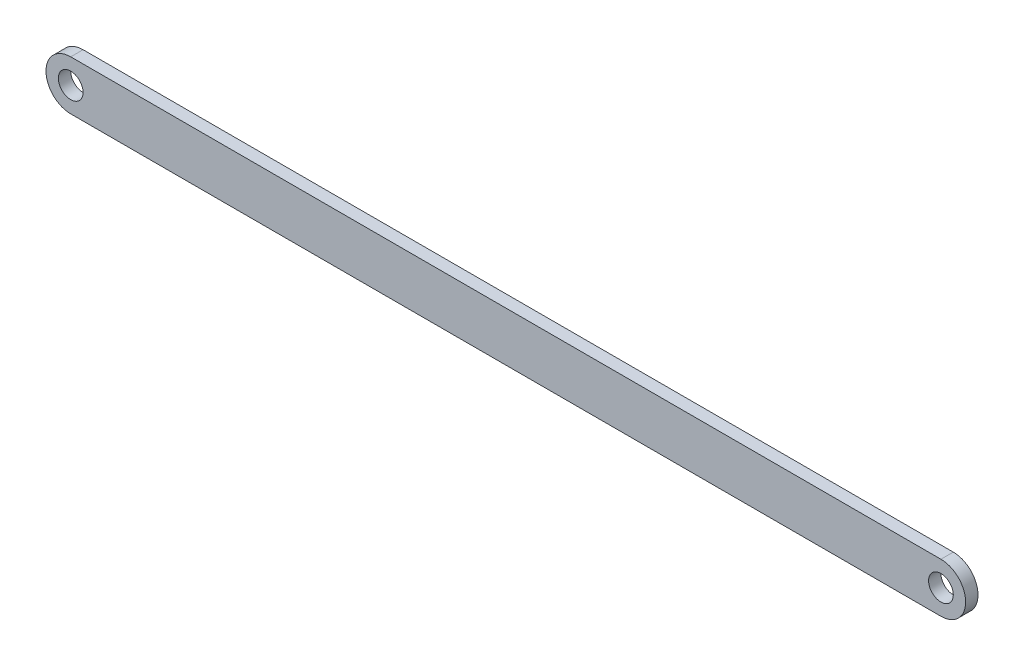
ISO-10303-21;
HEADER;
FILE_DESCRIPTION(('STEP AP214'),'2;1');
FILE_NAME('part.step','',(''),(''),'','','');
FILE_SCHEMA(('AUTOMOTIVE_DESIGN { 1 0 10303 214 1 1 1 1 }'));
ENDSEC;
DATA;
#1=APPLICATION_CONTEXT('core data for automotive mechanical design processes');
#2=APPLICATION_PROTOCOL_DEFINITION('international standard','automotive_design',2000,#1);
#3=PRODUCT_CONTEXT('',#1,'mechanical');
#4=PRODUCT('Part','Part','',(#3));
#5=PRODUCT_RELATED_PRODUCT_CATEGORY('part','',(#4));
#6=PRODUCT_DEFINITION_FORMATION('','',#4);
#7=PRODUCT_DEFINITION_CONTEXT('part definition',#1,'design');
#8=PRODUCT_DEFINITION('design','',#6,#7);
#9=PRODUCT_DEFINITION_SHAPE('','',#8);
#10=(LENGTH_UNIT() NAMED_UNIT(*) SI_UNIT(.MILLI.,.METRE.));
#11=(NAMED_UNIT(*) PLANE_ANGLE_UNIT() SI_UNIT($,.RADIAN.));
#12=(NAMED_UNIT(*) SI_UNIT($,.STERADIAN.) SOLID_ANGLE_UNIT());
#13=UNCERTAINTY_MEASURE_WITH_UNIT(LENGTH_MEASURE(1.E-05),#10,'distance_accuracy_value','');
#14=(GEOMETRIC_REPRESENTATION_CONTEXT(3) GLOBAL_UNCERTAINTY_ASSIGNED_CONTEXT((#13)) GLOBAL_UNIT_ASSIGNED_CONTEXT((#10,
#11,#12)) REPRESENTATION_CONTEXT('',''));
#15=CARTESIAN_POINT('',(0.,0.,0.));
#16=DIRECTION('',(0.,0.,1.));
#17=DIRECTION('',(1.,0.,0.));
#18=AXIS2_PLACEMENT_3D('',#15,#16,#17);
#19=CARTESIAN_POINT('',(35.21,0.,1.));
#20=DIRECTION('',(0.,0.,-1.));
#21=DIRECTION('',(-1.,0.,0.));
#22=AXIS2_PLACEMENT_3D('',#19,#20,#21);
#23=PLANE('',#22);
#24=CARTESIAN_POINT('',(35.21,0.,1.));
#25=DIRECTION('',(0.,0.,1.));
#26=DIRECTION('',(-1.,0.,0.));
#27=AXIS2_PLACEMENT_3D('',#24,#25,#26);
#28=CIRCLE('',#27,2.);
#29=CARTESIAN_POINT('',(35.21,-2.,1.));
#30=VERTEX_POINT('',#29);
#31=CARTESIAN_POINT('',(35.21,2.,1.));
#32=VERTEX_POINT('',#31);
#33=EDGE_CURVE('E96',#30,#32,#28,.T.);
#34=ORIENTED_EDGE('',*,*,#33,.T.);
#35=DIRECTION('',(-1.,0.,0.));
#36=VECTOR('',#35,1.);
#37=CARTESIAN_POINT('',(-35.21,2.,1.));
#38=LINE('',#37,#36);
#39=CARTESIAN_POINT('',(-35.21,2.,1.));
#40=VERTEX_POINT('',#39);
#41=EDGE_CURVE('E91',#32,#40,#38,.T.);
#42=ORIENTED_EDGE('',*,*,#41,.T.);
#43=CARTESIAN_POINT('',(-35.21,0.,1.));
#44=DIRECTION('',(0.,0.,1.));
#45=DIRECTION('',(1.,0.,0.));
#46=AXIS2_PLACEMENT_3D('',#43,#44,#45);
#47=CIRCLE('',#46,2.);
#48=CARTESIAN_POINT('',(-35.21,-2.,1.));
#49=VERTEX_POINT('',#48);
#50=EDGE_CURVE('E94',#40,#49,#47,.T.);
#51=ORIENTED_EDGE('',*,*,#50,.T.);
#52=DIRECTION('',(1.,0.,0.));
#53=VECTOR('',#52,1.);
#54=CARTESIAN_POINT('',(-35.21,-2.,1.));
#55=LINE('',#54,#53);
#56=EDGE_CURVE('E61',#49,#30,#55,.T.);
#57=ORIENTED_EDGE('',*,*,#56,.T.);
#58=EDGE_LOOP('',(#34,#42,#51,#57));
#59=FACE_BOUND('',#58,.T.);
#60=CARTESIAN_POINT('',(-35.21,0.,1.));
#61=DIRECTION('',(0.,0.,1.));
#62=DIRECTION('',(1.,0.,0.));
#63=AXIS2_PLACEMENT_3D('',#60,#61,#62);
#64=CIRCLE('',#63,0.999999999999998);
#65=CARTESIAN_POINT('',(-34.21,0.,1.));
#66=VERTEX_POINT('',#65);
#67=EDGE_CURVE('E116',#66,#66,#64,.T.);
#68=ORIENTED_EDGE('',*,*,#67,.F.);
#69=EDGE_LOOP('',(#68));
#70=FACE_BOUND('',#69,.T.);
#71=CARTESIAN_POINT('',(35.21,0.,1.));
#72=DIRECTION('',(0.,0.,1.));
#73=DIRECTION('',(1.,0.,0.));
#74=AXIS2_PLACEMENT_3D('',#71,#72,#73);
#75=CIRCLE('',#74,0.999999999999998);
#76=CARTESIAN_POINT('',(36.21,0.,1.));
#77=VERTEX_POINT('',#76);
#78=EDGE_CURVE('E138',#77,#77,#75,.T.);
#79=ORIENTED_EDGE('',*,*,#78,.F.);
#80=EDGE_LOOP('',(#79));
#81=FACE_BOUND('',#80,.T.);
#82=ADVANCED_FACE('F43',(#59,#70,#81),#23,.F.);
#83=CARTESIAN_POINT('',(35.21,0.,0.));
#84=DIRECTION('',(0.,0.,-1.));
#85=DIRECTION('',(-1.,0.,0.));
#86=AXIS2_PLACEMENT_3D('',#83,#84,#85);
#87=PLANE('',#86);
#88=CARTESIAN_POINT('',(-35.21,0.,0.));
#89=DIRECTION('',(0.,0.,1.));
#90=DIRECTION('',(1.,0.,0.));
#91=AXIS2_PLACEMENT_3D('',#88,#89,#90);
#92=CIRCLE('',#91,0.999999999999998);
#93=CARTESIAN_POINT('',(-34.21,0.,0.));
#94=VERTEX_POINT('',#93);
#95=EDGE_CURVE('E134',#94,#94,#92,.T.);
#96=ORIENTED_EDGE('',*,*,#95,.T.);
#97=EDGE_LOOP('',(#96));
#98=FACE_BOUND('',#97,.T.);
#99=CARTESIAN_POINT('',(35.21,0.,0.));
#100=DIRECTION('',(0.,0.,1.));
#101=DIRECTION('',(-1.,0.,0.));
#102=AXIS2_PLACEMENT_3D('',#99,#100,#101);
#103=CIRCLE('',#102,2.);
#104=CARTESIAN_POINT('',(35.21,-2.,0.));
#105=VERTEX_POINT('',#104);
#106=CARTESIAN_POINT('',(35.21,2.,0.));
#107=VERTEX_POINT('',#106);
#108=EDGE_CURVE('E112',#105,#107,#103,.T.);
#109=ORIENTED_EDGE('',*,*,#108,.F.);
#110=DIRECTION('',(1.,0.,0.));
#111=VECTOR('',#110,1.);
#112=CARTESIAN_POINT('',(-35.21,-2.,0.));
#113=LINE('',#112,#111);
#114=CARTESIAN_POINT('',(-35.21,-2.,0.));
#115=VERTEX_POINT('',#114);
#116=EDGE_CURVE('E84',#115,#105,#113,.T.);
#117=ORIENTED_EDGE('',*,*,#116,.F.);
#118=CARTESIAN_POINT('',(-35.21,0.,0.));
#119=DIRECTION('',(0.,0.,1.));
#120=DIRECTION('',(1.,0.,0.));
#121=AXIS2_PLACEMENT_3D('',#118,#119,#120);
#122=CIRCLE('',#121,2.);
#123=CARTESIAN_POINT('',(-35.21,2.,0.));
#124=VERTEX_POINT('',#123);
#125=EDGE_CURVE('E78',#124,#115,#122,.T.);
#126=ORIENTED_EDGE('',*,*,#125,.F.);
#127=DIRECTION('',(-1.,0.,0.));
#128=VECTOR('',#127,1.);
#129=CARTESIAN_POINT('',(-35.21,2.,0.));
#130=LINE('',#129,#128);
#131=EDGE_CURVE('E101',#107,#124,#130,.T.);
#132=ORIENTED_EDGE('',*,*,#131,.F.);
#133=EDGE_LOOP('',(#109,#117,#126,#132));
#134=FACE_BOUND('',#133,.T.);
#135=CARTESIAN_POINT('',(35.21,0.,0.));
#136=DIRECTION('',(0.,0.,1.));
#137=DIRECTION('',(1.,0.,0.));
#138=AXIS2_PLACEMENT_3D('',#135,#136,#137);
#139=CIRCLE('',#138,0.999999999999998);
#140=CARTESIAN_POINT('',(36.21,0.,0.));
#141=VERTEX_POINT('',#140);
#142=EDGE_CURVE('E142',#141,#141,#139,.T.);
#143=ORIENTED_EDGE('',*,*,#142,.T.);
#144=EDGE_LOOP('',(#143));
#145=FACE_BOUND('',#144,.T.);
#146=ADVANCED_FACE('F129',(#98,#134,#145),#87,.T.);
#147=CARTESIAN_POINT('',(35.21,0.,1.));
#148=DIRECTION('',(0.,0.,-1.));
#149=DIRECTION('',(-1.,0.,0.));
#150=AXIS2_PLACEMENT_3D('',#147,#148,#149);
#151=CYLINDRICAL_SURFACE('',#150,2.);
#152=ORIENTED_EDGE('',*,*,#108,.T.);
#153=DIRECTION('',(0.,0.,-1.));
#154=VECTOR('',#153,1.);
#155=CARTESIAN_POINT('',(35.21,2.,1.));
#156=LINE('',#155,#154);
#157=EDGE_CURVE('E11',#32,#107,#156,.T.);
#158=ORIENTED_EDGE('',*,*,#157,.F.);
#159=ORIENTED_EDGE('',*,*,#33,.F.);
#160=DIRECTION('',(0.,0.,-1.));
#161=VECTOR('',#160,1.);
#162=CARTESIAN_POINT('',(35.21,-2.,1.));
#163=LINE('',#162,#161);
#164=EDGE_CURVE('E108',#30,#105,#163,.T.);
#165=ORIENTED_EDGE('',*,*,#164,.T.);
#166=EDGE_LOOP('',(#152,#158,#159,#165));
#167=FACE_BOUND('',#166,.T.);
#168=ADVANCED_FACE('F45',(#167),#151,.T.);
#169=CARTESIAN_POINT('',(-35.21,2.,1.));
#170=DIRECTION('',(0.,-1.,0.));
#171=DIRECTION('',(0.,0.,-1.));
#172=AXIS2_PLACEMENT_3D('',#169,#170,#171);
#173=PLANE('',#172);
#174=ORIENTED_EDGE('',*,*,#131,.T.);
#175=DIRECTION('',(0.,0.,-1.));
#176=VECTOR('',#175,1.);
#177=CARTESIAN_POINT('',(-35.21,2.,1.));
#178=LINE('',#177,#176);
#179=EDGE_CURVE('E53',#40,#124,#178,.T.);
#180=ORIENTED_EDGE('',*,*,#179,.F.);
#181=ORIENTED_EDGE('',*,*,#41,.F.);
#182=ORIENTED_EDGE('',*,*,#157,.T.);
#183=EDGE_LOOP('',(#174,#180,#181,#182));
#184=FACE_BOUND('',#183,.T.);
#185=ADVANCED_FACE('F100',(#184),#173,.F.);
#186=CARTESIAN_POINT('',(-35.21,0.,1.));
#187=DIRECTION('',(0.,0.,-1.));
#188=DIRECTION('',(-1.,0.,0.));
#189=AXIS2_PLACEMENT_3D('',#186,#187,#188);
#190=CYLINDRICAL_SURFACE('',#189,2.);
#191=ORIENTED_EDGE('',*,*,#125,.T.);
#192=DIRECTION('',(0.,0.,-1.));
#193=VECTOR('',#192,1.);
#194=CARTESIAN_POINT('',(-35.21,-2.,1.));
#195=LINE('',#194,#193);
#196=EDGE_CURVE('E103',#49,#115,#195,.T.);
#197=ORIENTED_EDGE('',*,*,#196,.F.);
#198=ORIENTED_EDGE('',*,*,#50,.F.);
#199=ORIENTED_EDGE('',*,*,#179,.T.);
#200=EDGE_LOOP('',(#191,#197,#198,#199));
#201=FACE_BOUND('',#200,.T.);
#202=ADVANCED_FACE('F104',(#201),#190,.T.);
#203=CARTESIAN_POINT('',(-35.21,-2.,1.));
#204=DIRECTION('',(0.,1.,0.));
#205=DIRECTION('',(0.,0.,1.));
#206=AXIS2_PLACEMENT_3D('',#203,#204,#205);
#207=PLANE('',#206);
#208=ORIENTED_EDGE('',*,*,#116,.T.);
#209=ORIENTED_EDGE('',*,*,#164,.F.);
#210=ORIENTED_EDGE('',*,*,#56,.F.);
#211=ORIENTED_EDGE('',*,*,#196,.T.);
#212=EDGE_LOOP('',(#208,#209,#210,#211));
#213=FACE_BOUND('',#212,.T.);
#214=ADVANCED_FACE('F126',(#213),#207,.F.);
#215=CARTESIAN_POINT('',(-35.21,0.,1.));
#216=DIRECTION('',(0.,0.,-1.));
#217=DIRECTION('',(-1.,0.,0.));
#218=AXIS2_PLACEMENT_3D('',#215,#216,#217);
#219=CYLINDRICAL_SURFACE('',#218,0.999999999999998);
#220=ORIENTED_EDGE('',*,*,#67,.T.);
#221=EDGE_LOOP('',(#220));
#222=FACE_BOUND('',#221,.T.);
#223=ORIENTED_EDGE('',*,*,#95,.F.);
#224=EDGE_LOOP('',(#223));
#225=FACE_BOUND('',#224,.T.);
#226=ADVANCED_FACE('F161',(#222,#225),#219,.F.);
#227=CARTESIAN_POINT('',(35.21,0.,1.));
#228=DIRECTION('',(0.,0.,-1.));
#229=DIRECTION('',(-1.,0.,0.));
#230=AXIS2_PLACEMENT_3D('',#227,#228,#229);
#231=CYLINDRICAL_SURFACE('',#230,0.999999999999998);
#232=ORIENTED_EDGE('',*,*,#78,.T.);
#233=EDGE_LOOP('',(#232));
#234=FACE_BOUND('',#233,.T.);
#235=ORIENTED_EDGE('',*,*,#142,.F.);
#236=EDGE_LOOP('',(#235));
#237=FACE_BOUND('',#236,.T.);
#238=ADVANCED_FACE('F150',(#234,#237),#231,.F.);
#239=CLOSED_SHELL('',(#82,#146,#168,#185,#202,#214,#226,#238));
#240=MANIFOLD_SOLID_BREP('B2',#239);
#241=ADVANCED_BREP_SHAPE_REPRESENTATION('',(#18,#240),#14);
#242=SHAPE_DEFINITION_REPRESENTATION(#9,#241);
ENDSEC;
END-ISO-10303-21;
